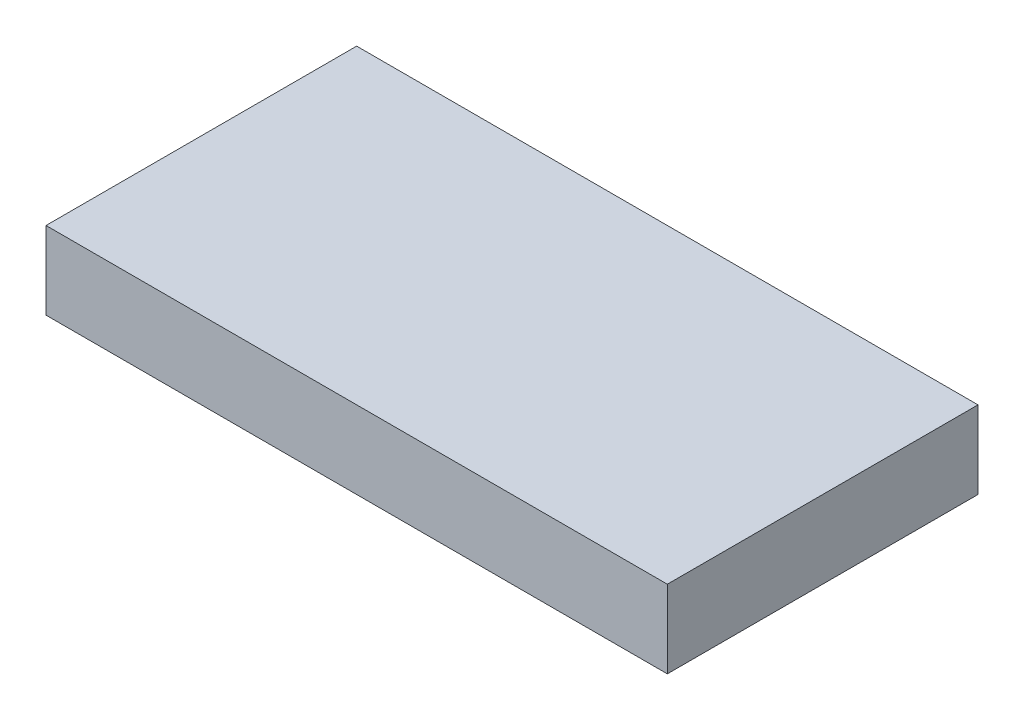
ISO-10303-21;
HEADER;
FILE_DESCRIPTION(('STEP AP214'),'2;1');
FILE_NAME('part.step','',(''),(''),'','','');
FILE_SCHEMA(('AUTOMOTIVE_DESIGN { 1 0 10303 214 1 1 1 1 }'));
ENDSEC;
DATA;
#1=APPLICATION_CONTEXT('core data for automotive mechanical design processes');
#2=APPLICATION_PROTOCOL_DEFINITION('international standard','automotive_design',2000,#1);
#3=PRODUCT_CONTEXT('',#1,'mechanical');
#4=PRODUCT('Part','Part','',(#3));
#5=PRODUCT_RELATED_PRODUCT_CATEGORY('part','',(#4));
#6=PRODUCT_DEFINITION_FORMATION('','',#4);
#7=PRODUCT_DEFINITION_CONTEXT('part definition',#1,'design');
#8=PRODUCT_DEFINITION('design','',#6,#7);
#9=PRODUCT_DEFINITION_SHAPE('','',#8);
#10=(LENGTH_UNIT() NAMED_UNIT(*) SI_UNIT(.MILLI.,.METRE.));
#11=(NAMED_UNIT(*) PLANE_ANGLE_UNIT() SI_UNIT($,.RADIAN.));
#12=(NAMED_UNIT(*) SI_UNIT($,.STERADIAN.) SOLID_ANGLE_UNIT());
#13=UNCERTAINTY_MEASURE_WITH_UNIT(LENGTH_MEASURE(1.E-05),#10,'distance_accuracy_value','');
#14=(GEOMETRIC_REPRESENTATION_CONTEXT(3) GLOBAL_UNCERTAINTY_ASSIGNED_CONTEXT((#13)) GLOBAL_UNIT_ASSIGNED_CONTEXT((#10,
#11,#12)) REPRESENTATION_CONTEXT('',''));
#15=CARTESIAN_POINT('',(0.,0.,0.));
#16=DIRECTION('',(0.,0.,1.));
#17=DIRECTION('',(1.,0.,0.));
#18=AXIS2_PLACEMENT_3D('',#15,#16,#17);
#19=CARTESIAN_POINT('',(20.,5.,-10.));
#20=DIRECTION('',(-1.,0.,0.));
#21=DIRECTION('',(0.,0.,1.));
#22=AXIS2_PLACEMENT_3D('',#19,#20,#21);
#23=PLANE('',#22);
#24=DIRECTION('',(0.,0.,-1.));
#25=VECTOR('',#24,1.);
#26=CARTESIAN_POINT('',(20.,0.,-10.));
#27=LINE('',#26,#25);
#28=CARTESIAN_POINT('',(20.,0.,10.));
#29=VERTEX_POINT('',#28);
#30=CARTESIAN_POINT('',(20.,0.,-10.));
#31=VERTEX_POINT('',#30);
#32=EDGE_CURVE('E98',#29,#31,#27,.T.);
#33=ORIENTED_EDGE('',*,*,#32,.T.);
#34=DIRECTION('',(0.,-1.,0.));
#35=VECTOR('',#34,1.);
#36=CARTESIAN_POINT('',(20.,5.,-10.));
#37=LINE('',#36,#35);
#38=CARTESIAN_POINT('',(20.,5.,-10.));
#39=VERTEX_POINT('',#38);
#40=EDGE_CURVE('E11',#39,#31,#37,.T.);
#41=ORIENTED_EDGE('',*,*,#40,.F.);
#42=DIRECTION('',(0.,0.,-1.));
#43=VECTOR('',#42,1.);
#44=CARTESIAN_POINT('',(20.,5.,-10.));
#45=LINE('',#44,#43);
#46=CARTESIAN_POINT('',(20.,5.,10.));
#47=VERTEX_POINT('',#46);
#48=EDGE_CURVE('E86',#47,#39,#45,.T.);
#49=ORIENTED_EDGE('',*,*,#48,.F.);
#50=DIRECTION('',(0.,-1.,0.));
#51=VECTOR('',#50,1.);
#52=CARTESIAN_POINT('',(20.,5.,10.));
#53=LINE('',#52,#51);
#54=EDGE_CURVE('E94',#47,#29,#53,.T.);
#55=ORIENTED_EDGE('',*,*,#54,.T.);
#56=EDGE_LOOP('',(#33,#41,#49,#55));
#57=FACE_BOUND('',#56,.T.);
#58=ADVANCED_FACE('F35',(#57),#23,.F.);
#59=CARTESIAN_POINT('',(-20.,5.,-10.));
#60=DIRECTION('',(0.,0.,1.));
#61=DIRECTION('',(1.,0.,0.));
#62=AXIS2_PLACEMENT_3D('',#59,#60,#61);
#63=PLANE('',#62);
#64=DIRECTION('',(-1.,0.,0.));
#65=VECTOR('',#64,1.);
#66=CARTESIAN_POINT('',(-20.,0.,-10.));
#67=LINE('',#66,#65);
#68=CARTESIAN_POINT('',(-20.,0.,-10.));
#69=VERTEX_POINT('',#68);
#70=EDGE_CURVE('E90',#31,#69,#67,.T.);
#71=ORIENTED_EDGE('',*,*,#70,.T.);
#72=DIRECTION('',(0.,-1.,0.));
#73=VECTOR('',#72,1.);
#74=CARTESIAN_POINT('',(-20.,5.,-10.));
#75=LINE('',#74,#73);
#76=CARTESIAN_POINT('',(-20.,5.,-10.));
#77=VERTEX_POINT('',#76);
#78=EDGE_CURVE('E43',#77,#69,#75,.T.);
#79=ORIENTED_EDGE('',*,*,#78,.F.);
#80=DIRECTION('',(-1.,0.,0.));
#81=VECTOR('',#80,1.);
#82=CARTESIAN_POINT('',(-20.,5.,-10.));
#83=LINE('',#82,#81);
#84=EDGE_CURVE('E81',#39,#77,#83,.T.);
#85=ORIENTED_EDGE('',*,*,#84,.F.);
#86=ORIENTED_EDGE('',*,*,#40,.T.);
#87=EDGE_LOOP('',(#71,#79,#85,#86));
#88=FACE_BOUND('',#87,.T.);
#89=ADVANCED_FACE('F89',(#88),#63,.F.);
#90=CARTESIAN_POINT('',(-20.,5.,-10.));
#91=DIRECTION('',(1.,0.,0.));
#92=DIRECTION('',(0.,0.,-1.));
#93=AXIS2_PLACEMENT_3D('',#90,#91,#92);
#94=PLANE('',#93);
#95=DIRECTION('',(0.,0.,1.));
#96=VECTOR('',#95,1.);
#97=CARTESIAN_POINT('',(-20.,0.,-10.));
#98=LINE('',#97,#96);
#99=CARTESIAN_POINT('',(-20.,0.,10.));
#100=VERTEX_POINT('',#99);
#101=EDGE_CURVE('E68',#69,#100,#98,.T.);
#102=ORIENTED_EDGE('',*,*,#101,.T.);
#103=DIRECTION('',(0.,-1.,0.));
#104=VECTOR('',#103,1.);
#105=CARTESIAN_POINT('',(-20.,5.,10.));
#106=LINE('',#105,#104);
#107=CARTESIAN_POINT('',(-20.,5.,10.));
#108=VERTEX_POINT('',#107);
#109=EDGE_CURVE('E91',#108,#100,#106,.T.);
#110=ORIENTED_EDGE('',*,*,#109,.F.);
#111=DIRECTION('',(0.,0.,1.));
#112=VECTOR('',#111,1.);
#113=CARTESIAN_POINT('',(-20.,5.,-10.));
#114=LINE('',#113,#112);
#115=EDGE_CURVE('E84',#77,#108,#114,.T.);
#116=ORIENTED_EDGE('',*,*,#115,.F.);
#117=ORIENTED_EDGE('',*,*,#78,.T.);
#118=EDGE_LOOP('',(#102,#110,#116,#117));
#119=FACE_BOUND('',#118,.T.);
#120=ADVANCED_FACE('F92',(#119),#94,.F.);
#121=CARTESIAN_POINT('',(-20.,5.,10.));
#122=DIRECTION('',(0.,0.,-1.));
#123=DIRECTION('',(-1.,0.,0.));
#124=AXIS2_PLACEMENT_3D('',#121,#122,#123);
#125=PLANE('',#124);
#126=DIRECTION('',(1.,0.,0.));
#127=VECTOR('',#126,1.);
#128=CARTESIAN_POINT('',(-20.,0.,10.));
#129=LINE('',#128,#127);
#130=EDGE_CURVE('E74',#100,#29,#129,.T.);
#131=ORIENTED_EDGE('',*,*,#130,.T.);
#132=ORIENTED_EDGE('',*,*,#54,.F.);
#133=DIRECTION('',(1.,0.,0.));
#134=VECTOR('',#133,1.);
#135=CARTESIAN_POINT('',(-20.,5.,10.));
#136=LINE('',#135,#134);
#137=EDGE_CURVE('E51',#108,#47,#136,.T.);
#138=ORIENTED_EDGE('',*,*,#137,.F.);
#139=ORIENTED_EDGE('',*,*,#109,.T.);
#140=EDGE_LOOP('',(#131,#132,#138,#139));
#141=FACE_BOUND('',#140,.T.);
#142=ADVANCED_FACE('F105',(#141),#125,.F.);
#143=CARTESIAN_POINT('',(0.,5.,0.));
#144=DIRECTION('',(0.,1.,0.));
#145=DIRECTION('',(0.,0.,1.));
#146=AXIS2_PLACEMENT_3D('',#143,#144,#145);
#147=PLANE('',#146);
#148=ORIENTED_EDGE('',*,*,#48,.T.);
#149=ORIENTED_EDGE('',*,*,#84,.T.);
#150=ORIENTED_EDGE('',*,*,#115,.T.);
#151=ORIENTED_EDGE('',*,*,#137,.T.);
#152=EDGE_LOOP('',(#148,#149,#150,#151));
#153=FACE_BOUND('',#152,.T.);
#154=ADVANCED_FACE('F82',(#153),#147,.T.);
#155=CARTESIAN_POINT('',(0.,0.,0.));
#156=DIRECTION('',(0.,1.,0.));
#157=DIRECTION('',(0.,0.,1.));
#158=AXIS2_PLACEMENT_3D('',#155,#156,#157);
#159=PLANE('',#158);
#160=ORIENTED_EDGE('',*,*,#32,.F.);
#161=ORIENTED_EDGE('',*,*,#130,.F.);
#162=ORIENTED_EDGE('',*,*,#101,.F.);
#163=ORIENTED_EDGE('',*,*,#70,.F.);
#164=EDGE_LOOP('',(#160,#161,#162,#163));
#165=FACE_BOUND('',#164,.T.);
#166=ADVANCED_FACE('F108',(#165),#159,.F.);
#167=CLOSED_SHELL('',(#58,#89,#120,#142,#154,#166));
#168=MANIFOLD_SOLID_BREP('B2',#167);
#169=ADVANCED_BREP_SHAPE_REPRESENTATION('',(#18,#168),#14);
#170=SHAPE_DEFINITION_REPRESENTATION(#9,#169);
ENDSEC;
END-ISO-10303-21;
